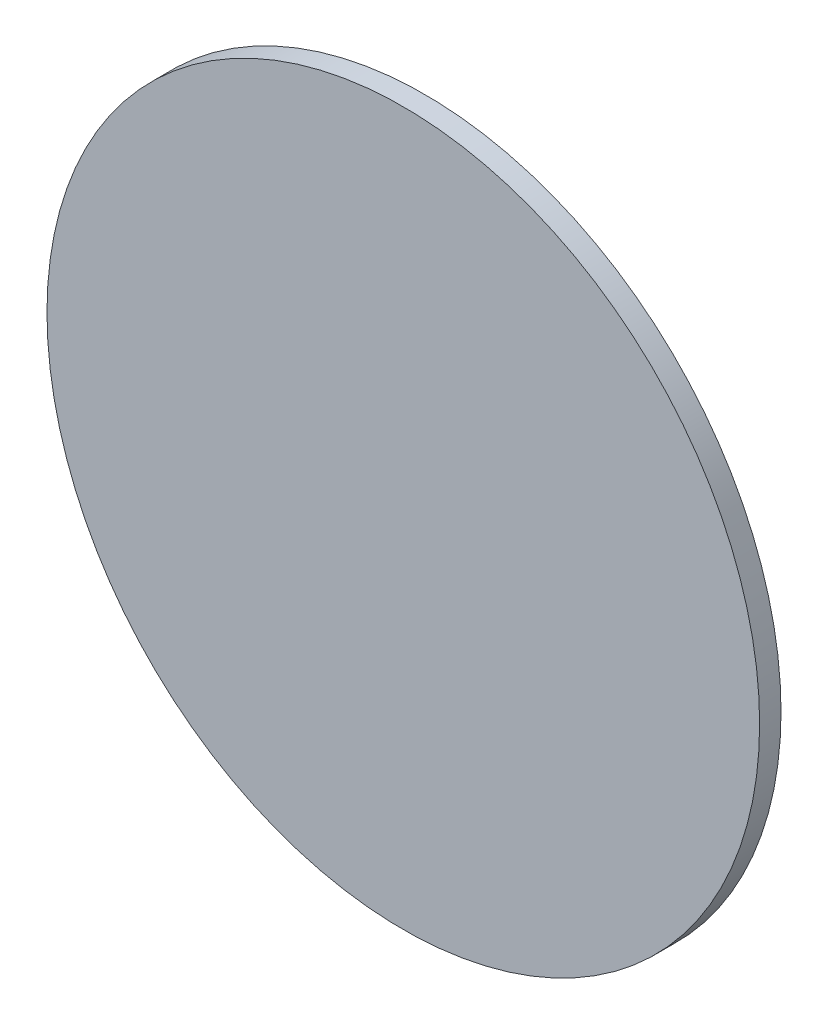
ISO-10303-21;
HEADER;
FILE_DESCRIPTION(('STEP AP214'),'2;1');
FILE_NAME('part.step','',(''),(''),'','','');
FILE_SCHEMA(('AUTOMOTIVE_DESIGN { 1 0 10303 214 1 1 1 1 }'));
ENDSEC;
DATA;
#1=APPLICATION_CONTEXT('core data for automotive mechanical design processes');
#2=APPLICATION_PROTOCOL_DEFINITION('international standard','automotive_design',2000,#1);
#3=PRODUCT_CONTEXT('',#1,'mechanical');
#4=PRODUCT('Part','Part','',(#3));
#5=PRODUCT_RELATED_PRODUCT_CATEGORY('part','',(#4));
#6=PRODUCT_DEFINITION_FORMATION('','',#4);
#7=PRODUCT_DEFINITION_CONTEXT('part definition',#1,'design');
#8=PRODUCT_DEFINITION('design','',#6,#7);
#9=PRODUCT_DEFINITION_SHAPE('','',#8);
#10=(LENGTH_UNIT() NAMED_UNIT(*) SI_UNIT(.MILLI.,.METRE.));
#11=(NAMED_UNIT(*) PLANE_ANGLE_UNIT() SI_UNIT($,.RADIAN.));
#12=(NAMED_UNIT(*) SI_UNIT($,.STERADIAN.) SOLID_ANGLE_UNIT());
#13=UNCERTAINTY_MEASURE_WITH_UNIT(LENGTH_MEASURE(1.E-05),#10,'distance_accuracy_value','');
#14=(GEOMETRIC_REPRESENTATION_CONTEXT(3) GLOBAL_UNCERTAINTY_ASSIGNED_CONTEXT((#13)) GLOBAL_UNIT_ASSIGNED_CONTEXT((#10,
#11,#12)) REPRESENTATION_CONTEXT('',''));
#15=CARTESIAN_POINT('',(0.,0.,0.));
#16=DIRECTION('',(0.,0.,1.));
#17=DIRECTION('',(1.,0.,0.));
#18=AXIS2_PLACEMENT_3D('',#15,#16,#17);
#19=CARTESIAN_POINT('',(0.,0.,3.));
#20=DIRECTION('',(0.,0.,-1.));
#21=DIRECTION('',(-1.,0.,0.));
#22=AXIS2_PLACEMENT_3D('',#19,#20,#21);
#23=CYLINDRICAL_SURFACE('',#22,50.);
#24=CARTESIAN_POINT('',(0.,0.,3.));
#25=DIRECTION('',(0.,0.,1.));
#26=DIRECTION('',(1.,0.,0.));
#27=AXIS2_PLACEMENT_3D('',#24,#25,#26);
#28=CIRCLE('',#27,50.);
#29=CARTESIAN_POINT('',(50.,0.,3.));
#30=VERTEX_POINT('',#29);
#31=EDGE_CURVE('E10',#30,#30,#28,.T.);
#32=ORIENTED_EDGE('',*,*,#31,.F.);
#33=EDGE_LOOP('',(#32));
#34=FACE_BOUND('',#33,.T.);
#35=CARTESIAN_POINT('',(0.,0.,0.));
#36=DIRECTION('',(0.,0.,1.));
#37=DIRECTION('',(1.,0.,0.));
#38=AXIS2_PLACEMENT_3D('',#35,#36,#37);
#39=CIRCLE('',#38,50.);
#40=CARTESIAN_POINT('',(50.,0.,0.));
#41=VERTEX_POINT('',#40);
#42=EDGE_CURVE('E34',#41,#41,#39,.T.);
#43=ORIENTED_EDGE('',*,*,#42,.T.);
#44=EDGE_LOOP('',(#43));
#45=FACE_BOUND('',#44,.T.);
#46=ADVANCED_FACE('F31',(#34,#45),#23,.T.);
#47=CARTESIAN_POINT('',(0.,0.,3.));
#48=DIRECTION('',(0.,0.,1.));
#49=DIRECTION('',(1.,0.,0.));
#50=AXIS2_PLACEMENT_3D('',#47,#48,#49);
#51=PLANE('',#50);
#52=ORIENTED_EDGE('',*,*,#31,.T.);
#53=EDGE_LOOP('',(#52));
#54=FACE_BOUND('',#53,.T.);
#55=ADVANCED_FACE('F46',(#54),#51,.T.);
#56=CARTESIAN_POINT('',(0.,0.,0.));
#57=DIRECTION('',(0.,0.,1.));
#58=DIRECTION('',(1.,0.,0.));
#59=AXIS2_PLACEMENT_3D('',#56,#57,#58);
#60=PLANE('',#59);
#61=ORIENTED_EDGE('',*,*,#42,.F.);
#62=EDGE_LOOP('',(#61));
#63=FACE_BOUND('',#62,.T.);
#64=ADVANCED_FACE('F44',(#63),#60,.F.);
#65=CLOSED_SHELL('',(#46,#55,#64));
#66=MANIFOLD_SOLID_BREP('B2',#65);
#67=ADVANCED_BREP_SHAPE_REPRESENTATION('',(#18,#66),#14);
#68=SHAPE_DEFINITION_REPRESENTATION(#9,#67);
ENDSEC;
END-ISO-10303-21;
